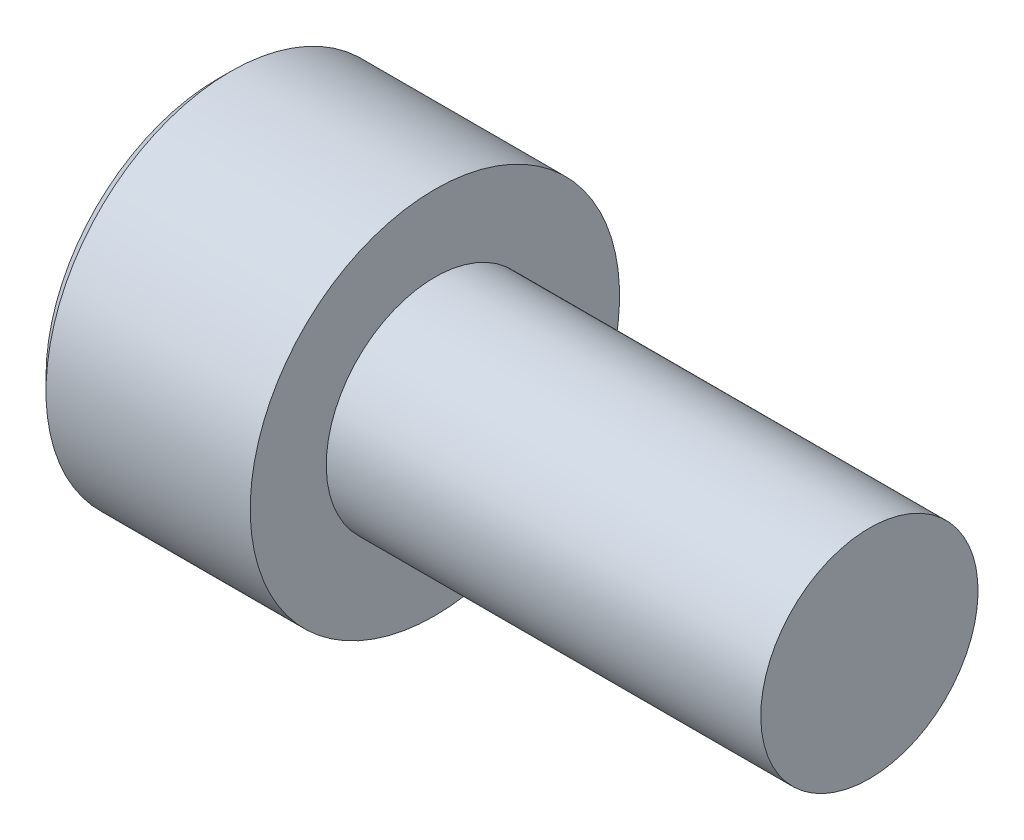
ISO-10303-21;
HEADER;
FILE_DESCRIPTION(('STEP AP214'),'2;1');
FILE_NAME('part.step','',(''),(''),'','','');
FILE_SCHEMA(('AUTOMOTIVE_DESIGN { 1 0 10303 214 1 1 1 1 }'));
ENDSEC;
DATA;
#1=APPLICATION_CONTEXT('core data for automotive mechanical design processes');
#2=APPLICATION_PROTOCOL_DEFINITION('international standard','automotive_design',2000,#1);
#3=PRODUCT_CONTEXT('',#1,'mechanical');
#4=PRODUCT('Part','Part','',(#3));
#5=PRODUCT_RELATED_PRODUCT_CATEGORY('part','',(#4));
#6=PRODUCT_DEFINITION_FORMATION('','',#4);
#7=PRODUCT_DEFINITION_CONTEXT('part definition',#1,'design');
#8=PRODUCT_DEFINITION('design','',#6,#7);
#9=PRODUCT_DEFINITION_SHAPE('','',#8);
#10=(LENGTH_UNIT() NAMED_UNIT(*) SI_UNIT(.MILLI.,.METRE.));
#11=(NAMED_UNIT(*) PLANE_ANGLE_UNIT() SI_UNIT($,.RADIAN.));
#12=(NAMED_UNIT(*) SI_UNIT($,.STERADIAN.) SOLID_ANGLE_UNIT());
#13=UNCERTAINTY_MEASURE_WITH_UNIT(LENGTH_MEASURE(1.E-05),#10,'distance_accuracy_value','');
#14=(GEOMETRIC_REPRESENTATION_CONTEXT(3) GLOBAL_UNCERTAINTY_ASSIGNED_CONTEXT((#13)) GLOBAL_UNIT_ASSIGNED_CONTEXT((#10,
#11,#12)) REPRESENTATION_CONTEXT('',''));
#15=CARTESIAN_POINT('',(0.,0.,0.));
#16=DIRECTION('',(0.,0.,1.));
#17=DIRECTION('',(1.,0.,0.));
#18=AXIS2_PLACEMENT_3D('',#15,#16,#17);
#19=CARTESIAN_POINT('',(-5.,0.,0.));
#20=DIRECTION('',(-1.,0.,0.));
#21=DIRECTION('',(0.,-1.,0.));
#22=AXIS2_PLACEMENT_3D('',#19,#20,#21);
#23=CYLINDRICAL_SURFACE('',#22,2.5);
#24=CARTESIAN_POINT('',(0.,0.,0.));
#25=DIRECTION('',(-1.,0.,0.));
#26=DIRECTION('',(0.,-1.,0.));
#27=AXIS2_PLACEMENT_3D('',#24,#25,#26);
#28=CIRCLE('',#27,2.5);
#29=CARTESIAN_POINT('',(0.,-2.5,0.));
#30=VERTEX_POINT('',#29);
#31=EDGE_CURVE('E177',#30,#30,#28,.T.);
#32=ORIENTED_EDGE('',*,*,#31,.F.);
#33=EDGE_LOOP('',(#32));
#34=FACE_BOUND('',#33,.T.);
#35=CARTESIAN_POINT('',(10.,0.,0.));
#36=DIRECTION('',(-1.,0.,0.));
#37=DIRECTION('',(0.,-1.,0.));
#38=AXIS2_PLACEMENT_3D('',#35,#36,#37);
#39=CIRCLE('',#38,2.5);
#40=CARTESIAN_POINT('',(10.,-2.5,0.));
#41=VERTEX_POINT('',#40);
#42=EDGE_CURVE('E183',#41,#41,#39,.T.);
#43=ORIENTED_EDGE('',*,*,#42,.T.);
#44=EDGE_LOOP('',(#43));
#45=FACE_BOUND('',#44,.T.);
#46=ADVANCED_FACE('F36',(#34,#45),#23,.T.);
#47=CARTESIAN_POINT('',(10.,0.,0.));
#48=DIRECTION('',(-1.,0.,0.));
#49=DIRECTION('',(0.,-1.,0.));
#50=AXIS2_PLACEMENT_3D('',#47,#48,#49);
#51=PLANE('',#50);
#52=ORIENTED_EDGE('',*,*,#42,.F.);
#53=EDGE_LOOP('',(#52));
#54=FACE_BOUND('',#53,.T.);
#55=ADVANCED_FACE('F201',(#54),#51,.F.);
#56=CARTESIAN_POINT('',(-5.,4.25,0.));
#57=DIRECTION('',(1.,0.,0.));
#58=DIRECTION('',(0.,1.,0.));
#59=AXIS2_PLACEMENT_3D('',#56,#57,#58);
#60=PLANE('',#59);
#61=CARTESIAN_POINT('',(-5.,0.,0.));
#62=DIRECTION('',(1.,0.,0.));
#63=DIRECTION('',(0.,1.,0.));
#64=AXIS2_PLACEMENT_3D('',#61,#62,#63);
#65=CIRCLE('',#64,3.94999999999999);
#66=CARTESIAN_POINT('',(-5.,3.95,0.));
#67=VERTEX_POINT('',#66);
#68=EDGE_CURVE('E44',#67,#67,#65,.F.);
#69=ORIENTED_EDGE('',*,*,#68,.T.);
#70=EDGE_LOOP('',(#69));
#71=FACE_BOUND('',#70,.T.);
#72=DIRECTION('',(0.,0.866025403784438,-0.5));
#73=VECTOR('',#72,1.);
#74=CARTESIAN_POINT('',(-5.,0.,2.3094010767585));
#75=LINE('',#74,#73);
#76=CARTESIAN_POINT('',(-5.,0.,2.3094010767585));
#77=VERTEX_POINT('',#76);
#78=CARTESIAN_POINT('',(-5.,2.,1.15470053837925));
#79=VERTEX_POINT('',#78);
#80=EDGE_CURVE('E149',#77,#79,#75,.T.);
#81=ORIENTED_EDGE('',*,*,#80,.F.);
#82=DIRECTION('',(0.,0.866025403784439,0.5));
#83=VECTOR('',#82,1.);
#84=CARTESIAN_POINT('',(-5.,-2.,1.15470053837925));
#85=LINE('',#84,#83);
#86=CARTESIAN_POINT('',(-5.,-2.,1.15470053837925));
#87=VERTEX_POINT('',#86);
#88=EDGE_CURVE('E51',#87,#77,#85,.T.);
#89=ORIENTED_EDGE('',*,*,#88,.F.);
#90=DIRECTION('',(0.,0.,1.));
#91=VECTOR('',#90,1.);
#92=CARTESIAN_POINT('',(-5.,-2.,-1.15470053837925));
#93=LINE('',#92,#91);
#94=CARTESIAN_POINT('',(-5.,-2.,-1.15470053837925));
#95=VERTEX_POINT('',#94);
#96=EDGE_CURVE('E117',#95,#87,#93,.T.);
#97=ORIENTED_EDGE('',*,*,#96,.F.);
#98=DIRECTION('',(0.,-0.866025403784438,0.5));
#99=VECTOR('',#98,1.);
#100=CARTESIAN_POINT('',(-5.,0.,-2.3094010767585));
#101=LINE('',#100,#99);
#102=CARTESIAN_POINT('',(-5.,0.,-2.3094010767585));
#103=VERTEX_POINT('',#102);
#104=EDGE_CURVE('E157',#103,#95,#101,.T.);
#105=ORIENTED_EDGE('',*,*,#104,.F.);
#106=DIRECTION('',(0.,-0.866025403784439,-0.5));
#107=VECTOR('',#106,1.);
#108=CARTESIAN_POINT('',(-5.,2.,-1.15470053837925));
#109=LINE('',#108,#107);
#110=CARTESIAN_POINT('',(-5.,2.,-1.15470053837925));
#111=VERTEX_POINT('',#110);
#112=EDGE_CURVE('E154',#111,#103,#109,.T.);
#113=ORIENTED_EDGE('',*,*,#112,.F.);
#114=DIRECTION('',(0.,0.,-1.));
#115=VECTOR('',#114,1.);
#116=CARTESIAN_POINT('',(-5.,2.,1.15470053837925));
#117=LINE('',#116,#115);
#118=EDGE_CURVE('E151',#79,#111,#117,.T.);
#119=ORIENTED_EDGE('',*,*,#118,.F.);
#120=EDGE_LOOP('',(#81,#89,#97,#105,#113,#119));
#121=FACE_BOUND('',#120,.T.);
#122=ADVANCED_FACE('F188',(#71,#121),#60,.F.);
#123=CARTESIAN_POINT('',(-5.,0.,0.));
#124=DIRECTION('',(-1.,0.,0.));
#125=DIRECTION('',(0.,-1.,0.));
#126=AXIS2_PLACEMENT_3D('',#123,#124,#125);
#127=CYLINDRICAL_SURFACE('',#126,4.25);
#128=CARTESIAN_POINT('',(-4.69999999999999,0.,0.));
#129=DIRECTION('',(1.,0.,0.));
#130=DIRECTION('',(0.,1.,0.));
#131=AXIS2_PLACEMENT_3D('',#128,#129,#130);
#132=CIRCLE('',#131,4.25);
#133=CARTESIAN_POINT('',(-4.69999999999999,4.25,0.));
#134=VERTEX_POINT('',#133);
#135=EDGE_CURVE('E11',#134,#134,#132,.T.);
#136=ORIENTED_EDGE('',*,*,#135,.T.);
#137=EDGE_LOOP('',(#136));
#138=FACE_BOUND('',#137,.T.);
#139=CARTESIAN_POINT('',(0.,0.,0.));
#140=DIRECTION('',(-1.,0.,0.));
#141=DIRECTION('',(0.,-1.,0.));
#142=AXIS2_PLACEMENT_3D('',#139,#140,#141);
#143=CIRCLE('',#142,4.25);
#144=CARTESIAN_POINT('',(0.,-4.25,0.));
#145=VERTEX_POINT('',#144);
#146=EDGE_CURVE('E180',#145,#145,#143,.T.);
#147=ORIENTED_EDGE('',*,*,#146,.T.);
#148=EDGE_LOOP('',(#147));
#149=FACE_BOUND('',#148,.T.);
#150=ADVANCED_FACE('F213',(#138,#149),#127,.T.);
#151=CARTESIAN_POINT('',(0.,2.50000000000001,0.));
#152=DIRECTION('',(-1.,0.,0.));
#153=DIRECTION('',(0.,-1.,0.));
#154=AXIS2_PLACEMENT_3D('',#151,#152,#153);
#155=PLANE('',#154);
#156=ORIENTED_EDGE('',*,*,#146,.F.);
#157=EDGE_LOOP('',(#156));
#158=FACE_BOUND('',#157,.T.);
#159=ORIENTED_EDGE('',*,*,#31,.T.);
#160=EDGE_LOOP('',(#159));
#161=FACE_BOUND('',#160,.T.);
#162=ADVANCED_FACE('F216',(#158,#161),#155,.F.);
#163=CARTESIAN_POINT('',(-3.,-2.,1.15470053837925));
#164=DIRECTION('',(0.,-0.5,0.866025403784439));
#165=DIRECTION('',(0.,-0.866025403784439,-0.5));
#166=AXIS2_PLACEMENT_3D('',#163,#164,#165);
#167=PLANE('',#166);
#168=DIRECTION('',(0.,0.866025403784439,0.5));
#169=VECTOR('',#168,1.);
#170=CARTESIAN_POINT('',(-3.,-2.,1.15470053837925));
#171=LINE('',#170,#169);
#172=CARTESIAN_POINT('',(-3.,-2.,1.15470053837925));
#173=VERTEX_POINT('',#172);
#174=CARTESIAN_POINT('',(-3.,-0.999999999999999,1.73205080756888));
#175=VERTEX_POINT('',#174);
#176=EDGE_CURVE('E116',#173,#175,#171,.T.);
#177=ORIENTED_EDGE('',*,*,#176,.F.);
#178=DIRECTION('',(-1.,0.,0.));
#179=VECTOR('',#178,1.);
#180=CARTESIAN_POINT('',(-3.,-2.,1.15470053837925));
#181=LINE('',#180,#179);
#182=EDGE_CURVE('E161',#173,#87,#181,.T.);
#183=ORIENTED_EDGE('',*,*,#182,.T.);
#184=ORIENTED_EDGE('',*,*,#88,.T.);
#185=DIRECTION('',(-1.,0.,0.));
#186=VECTOR('',#185,1.);
#187=CARTESIAN_POINT('',(-3.,0.,2.3094010767585));
#188=LINE('',#187,#186);
#189=CARTESIAN_POINT('',(-3.,0.,2.3094010767585));
#190=VERTEX_POINT('',#189);
#191=EDGE_CURVE('E120',#190,#77,#188,.T.);
#192=ORIENTED_EDGE('',*,*,#191,.F.);
#193=EDGE_CURVE('E110',#175,#190,#171,.T.);
#194=ORIENTED_EDGE('',*,*,#193,.F.);
#195=EDGE_LOOP('',(#177,#183,#184,#192,#194));
#196=FACE_BOUND('',#195,.T.);
#197=ADVANCED_FACE('F121',(#196),#167,.F.);
#198=CARTESIAN_POINT('',(-3.,-2.,-1.15470053837925));
#199=DIRECTION('',(0.,-1.,0.));
#200=DIRECTION('',(1.,0.,0.));
#201=AXIS2_PLACEMENT_3D('',#198,#199,#200);
#202=PLANE('',#201);
#203=DIRECTION('',(0.,0.,1.));
#204=VECTOR('',#203,1.);
#205=CARTESIAN_POINT('',(-3.,-2.,-1.15470053837925));
#206=LINE('',#205,#204);
#207=CARTESIAN_POINT('',(-3.,-2.,-1.15470053837925));
#208=VERTEX_POINT('',#207);
#209=CARTESIAN_POINT('',(-3.,-2.,0.));
#210=VERTEX_POINT('',#209);
#211=EDGE_CURVE('E125',#208,#210,#206,.T.);
#212=ORIENTED_EDGE('',*,*,#211,.F.);
#213=DIRECTION('',(-1.,0.,0.));
#214=VECTOR('',#213,1.);
#215=CARTESIAN_POINT('',(-3.,-2.,-1.15470053837925));
#216=LINE('',#215,#214);
#217=EDGE_CURVE('E164',#208,#95,#216,.T.);
#218=ORIENTED_EDGE('',*,*,#217,.T.);
#219=ORIENTED_EDGE('',*,*,#96,.T.);
#220=ORIENTED_EDGE('',*,*,#182,.F.);
#221=EDGE_CURVE('E145',#210,#173,#206,.T.);
#222=ORIENTED_EDGE('',*,*,#221,.F.);
#223=EDGE_LOOP('',(#212,#218,#219,#220,#222));
#224=FACE_BOUND('',#223,.T.);
#225=ADVANCED_FACE('F223',(#224),#202,.F.);
#226=CARTESIAN_POINT('',(-3.,0.,-2.3094010767585));
#227=DIRECTION('',(0.,-0.5,-0.866025403784439));
#228=DIRECTION('',(0.,0.866025403784439,-0.5));
#229=AXIS2_PLACEMENT_3D('',#226,#227,#228);
#230=PLANE('',#229);
#231=DIRECTION('',(0.,-0.866025403784438,0.5));
#232=VECTOR('',#231,1.);
#233=CARTESIAN_POINT('',(-3.,0.,-2.3094010767585));
#234=LINE('',#233,#232);
#235=CARTESIAN_POINT('',(-3.,0.,-2.3094010767585));
#236=VERTEX_POINT('',#235);
#237=CARTESIAN_POINT('',(-3.,-0.999999999999998,-1.73205080756888));
#238=VERTEX_POINT('',#237);
#239=EDGE_CURVE('E142',#236,#238,#234,.T.);
#240=ORIENTED_EDGE('',*,*,#239,.F.);
#241=DIRECTION('',(-1.,0.,0.));
#242=VECTOR('',#241,1.);
#243=CARTESIAN_POINT('',(-3.,0.,-2.3094010767585));
#244=LINE('',#243,#242);
#245=EDGE_CURVE('E167',#236,#103,#244,.T.);
#246=ORIENTED_EDGE('',*,*,#245,.T.);
#247=ORIENTED_EDGE('',*,*,#104,.T.);
#248=ORIENTED_EDGE('',*,*,#217,.F.);
#249=EDGE_CURVE('E141',#238,#208,#234,.T.);
#250=ORIENTED_EDGE('',*,*,#249,.F.);
#251=EDGE_LOOP('',(#240,#246,#247,#248,#250));
#252=FACE_BOUND('',#251,.T.);
#253=ADVANCED_FACE('F234',(#252),#230,.F.);
#254=CARTESIAN_POINT('',(-3.,2.,-1.15470053837925));
#255=DIRECTION('',(0.,0.5,-0.866025403784439));
#256=DIRECTION('',(0.,0.866025403784439,0.5));
#257=AXIS2_PLACEMENT_3D('',#254,#255,#256);
#258=PLANE('',#257);
#259=DIRECTION('',(0.,-0.866025403784439,-0.5));
#260=VECTOR('',#259,1.);
#261=CARTESIAN_POINT('',(-3.,2.,-1.15470053837925));
#262=LINE('',#261,#260);
#263=CARTESIAN_POINT('',(-3.,2.,-1.15470053837925));
#264=VERTEX_POINT('',#263);
#265=CARTESIAN_POINT('',(-3.,1.,-1.73205080756888));
#266=VERTEX_POINT('',#265);
#267=EDGE_CURVE('E138',#264,#266,#262,.T.);
#268=ORIENTED_EDGE('',*,*,#267,.F.);
#269=DIRECTION('',(-1.,0.,0.));
#270=VECTOR('',#269,1.);
#271=CARTESIAN_POINT('',(-3.,2.,-1.15470053837925));
#272=LINE('',#271,#270);
#273=EDGE_CURVE('E170',#264,#111,#272,.T.);
#274=ORIENTED_EDGE('',*,*,#273,.T.);
#275=ORIENTED_EDGE('',*,*,#112,.T.);
#276=ORIENTED_EDGE('',*,*,#245,.F.);
#277=EDGE_CURVE('E137',#266,#236,#262,.T.);
#278=ORIENTED_EDGE('',*,*,#277,.F.);
#279=EDGE_LOOP('',(#268,#274,#275,#276,#278));
#280=FACE_BOUND('',#279,.T.);
#281=ADVANCED_FACE('F230',(#280),#258,.F.);
#282=CARTESIAN_POINT('',(-3.,2.,1.15470053837925));
#283=DIRECTION('',(0.,1.,0.));
#284=DIRECTION('',(0.,0.,1.));
#285=AXIS2_PLACEMENT_3D('',#282,#283,#284);
#286=PLANE('',#285);
#287=DIRECTION('',(0.,0.,-1.));
#288=VECTOR('',#287,1.);
#289=CARTESIAN_POINT('',(-3.,2.,1.15470053837925));
#290=LINE('',#289,#288);
#291=CARTESIAN_POINT('',(-3.,2.,1.15470053837925));
#292=VERTEX_POINT('',#291);
#293=CARTESIAN_POINT('',(-3.,2.,0.));
#294=VERTEX_POINT('',#293);
#295=EDGE_CURVE('E133',#292,#294,#290,.T.);
#296=ORIENTED_EDGE('',*,*,#295,.F.);
#297=DIRECTION('',(-1.,0.,0.));
#298=VECTOR('',#297,1.);
#299=CARTESIAN_POINT('',(-3.,2.,1.15470053837925));
#300=LINE('',#299,#298);
#301=EDGE_CURVE('E124',#292,#79,#300,.T.);
#302=ORIENTED_EDGE('',*,*,#301,.T.);
#303=ORIENTED_EDGE('',*,*,#118,.T.);
#304=ORIENTED_EDGE('',*,*,#273,.F.);
#305=EDGE_CURVE('E131',#294,#264,#290,.T.);
#306=ORIENTED_EDGE('',*,*,#305,.F.);
#307=EDGE_LOOP('',(#296,#302,#303,#304,#306));
#308=FACE_BOUND('',#307,.T.);
#309=ADVANCED_FACE('F227',(#308),#286,.F.);
#310=CARTESIAN_POINT('',(-3.,0.,2.3094010767585));
#311=DIRECTION('',(0.,0.5,0.866025403784438));
#312=DIRECTION('',(0.,-0.866025403784439,0.5));
#313=AXIS2_PLACEMENT_3D('',#310,#311,#312);
#314=PLANE('',#313);
#315=DIRECTION('',(0.,0.866025403784438,-0.5));
#316=VECTOR('',#315,1.);
#317=CARTESIAN_POINT('',(-3.,0.,2.3094010767585));
#318=LINE('',#317,#316);
#319=CARTESIAN_POINT('',(-3.,1.,1.73205080756888));
#320=VERTEX_POINT('',#319);
#321=EDGE_CURVE('E59',#190,#320,#318,.T.);
#322=ORIENTED_EDGE('',*,*,#321,.F.);
#323=ORIENTED_EDGE('',*,*,#191,.T.);
#324=ORIENTED_EDGE('',*,*,#80,.T.);
#325=ORIENTED_EDGE('',*,*,#301,.F.);
#326=EDGE_CURVE('E129',#320,#292,#318,.T.);
#327=ORIENTED_EDGE('',*,*,#326,.F.);
#328=EDGE_LOOP('',(#322,#323,#324,#325,#327));
#329=FACE_BOUND('',#328,.T.);
#330=ADVANCED_FACE('F127',(#329),#314,.F.);
#331=CARTESIAN_POINT('',(-3.,0.,0.));
#332=DIRECTION('',(-1.,0.,0.));
#333=DIRECTION('',(0.,0.,1.));
#334=AXIS2_PLACEMENT_3D('',#331,#332,#333);
#335=PLANE('',#334);
#336=CARTESIAN_POINT('',(-3.,0.,0.));
#337=DIRECTION('',(1.,0.,0.));
#338=DIRECTION('',(0.,1.,0.));
#339=AXIS2_PLACEMENT_3D('',#336,#337,#338);
#340=CIRCLE('',#339,2.);
#341=EDGE_CURVE('E267',#175,#210,#340,.T.);
#342=ORIENTED_EDGE('',*,*,#341,.T.);
#343=ORIENTED_EDGE('',*,*,#221,.T.);
#344=ORIENTED_EDGE('',*,*,#176,.T.);
#345=EDGE_LOOP('',(#342,#343,#344));
#346=FACE_BOUND('',#345,.T.);
#347=ADVANCED_FACE('F226',(#346),#335,.T.);
#348=EDGE_CURVE('E268',#210,#238,#340,.T.);
#349=ORIENTED_EDGE('',*,*,#348,.T.);
#350=ORIENTED_EDGE('',*,*,#249,.T.);
#351=ORIENTED_EDGE('',*,*,#211,.T.);
#352=EDGE_LOOP('',(#349,#350,#351));
#353=FACE_BOUND('',#352,.T.);
#354=ADVANCED_FACE('F243',(#353),#335,.T.);
#355=EDGE_CURVE('E270',#238,#266,#340,.T.);
#356=ORIENTED_EDGE('',*,*,#355,.T.);
#357=ORIENTED_EDGE('',*,*,#277,.T.);
#358=ORIENTED_EDGE('',*,*,#239,.T.);
#359=EDGE_LOOP('',(#356,#357,#358));
#360=FACE_BOUND('',#359,.T.);
#361=ADVANCED_FACE('F248',(#360),#335,.T.);
#362=EDGE_CURVE('E163',#266,#294,#340,.T.);
#363=ORIENTED_EDGE('',*,*,#362,.T.);
#364=ORIENTED_EDGE('',*,*,#305,.T.);
#365=ORIENTED_EDGE('',*,*,#267,.T.);
#366=EDGE_LOOP('',(#363,#364,#365));
#367=FACE_BOUND('',#366,.T.);
#368=ADVANCED_FACE('F255',(#367),#335,.T.);
#369=EDGE_CURVE('E175',#294,#320,#340,.T.);
#370=ORIENTED_EDGE('',*,*,#369,.T.);
#371=ORIENTED_EDGE('',*,*,#326,.T.);
#372=ORIENTED_EDGE('',*,*,#295,.T.);
#373=EDGE_LOOP('',(#370,#371,#372));
#374=FACE_BOUND('',#373,.T.);
#375=ADVANCED_FACE('F251',(#374),#335,.T.);
#376=EDGE_CURVE('E113',#320,#175,#340,.T.);
#377=ORIENTED_EDGE('',*,*,#376,.T.);
#378=ORIENTED_EDGE('',*,*,#193,.T.);
#379=ORIENTED_EDGE('',*,*,#321,.T.);
#380=EDGE_LOOP('',(#377,#378,#379));
#381=FACE_BOUND('',#380,.T.);
#382=ADVANCED_FACE('F111',(#381),#335,.T.);
#383=CARTESIAN_POINT('',(-1.84529946162073,0.,0.));
#384=DIRECTION('',(-1.,0.,0.));
#385=DIRECTION('',(0.,-1.,0.));
#386=AXIS2_PLACEMENT_3D('',#383,#384,#385);
#387=CONICAL_SURFACE('',#386,0.,1.04719755119659);
#388=ORIENTED_EDGE('',*,*,#369,.F.);
#389=ORIENTED_EDGE('',*,*,#362,.F.);
#390=ORIENTED_EDGE('',*,*,#355,.F.);
#391=ORIENTED_EDGE('',*,*,#348,.F.);
#392=ORIENTED_EDGE('',*,*,#341,.F.);
#393=ORIENTED_EDGE('',*,*,#376,.F.);
#394=EDGE_LOOP('',(#388,#389,#390,#391,#392,#393));
#395=FACE_BOUND('',#394,.T.);
#396=CARTESIAN_POINT('',(-1.84529946162073,0.,0.));
#397=VERTEX_POINT('',#396);
#398=VERTEX_LOOP('',#397);
#399=FACE_BOUND('',#398,.T.);
#400=ADVANCED_FACE('F192',(#395,#399),#387,.F.);
#401=CARTESIAN_POINT('',(-5.,0.,0.));
#402=DIRECTION('',(1.,0.,0.));
#403=DIRECTION('',(0.,1.,0.));
#404=AXIS2_PLACEMENT_3D('',#401,#402,#403);
#405=CONICAL_SURFACE('',#404,3.94999999999999,0.785398163397448);
#406=ORIENTED_EDGE('',*,*,#135,.F.);
#407=EDGE_LOOP('',(#406));
#408=FACE_BOUND('',#407,.T.);
#409=ORIENTED_EDGE('',*,*,#68,.F.);
#410=EDGE_LOOP('',(#409));
#411=FACE_BOUND('',#410,.T.);
#412=ADVANCED_FACE('F38',(#408,#411),#405,.T.);
#413=CLOSED_SHELL('',(#46,#55,#122,#150,#162,#197,#225,#253,#281,#309,#330,#347,#354,#361,#368,
#375,#382,#400,#412));
#414=MANIFOLD_SOLID_BREP('B2',#413);
#415=ADVANCED_BREP_SHAPE_REPRESENTATION('',(#18,#414),#14);
#416=SHAPE_DEFINITION_REPRESENTATION(#9,#415);
ENDSEC;
END-ISO-10303-21;
